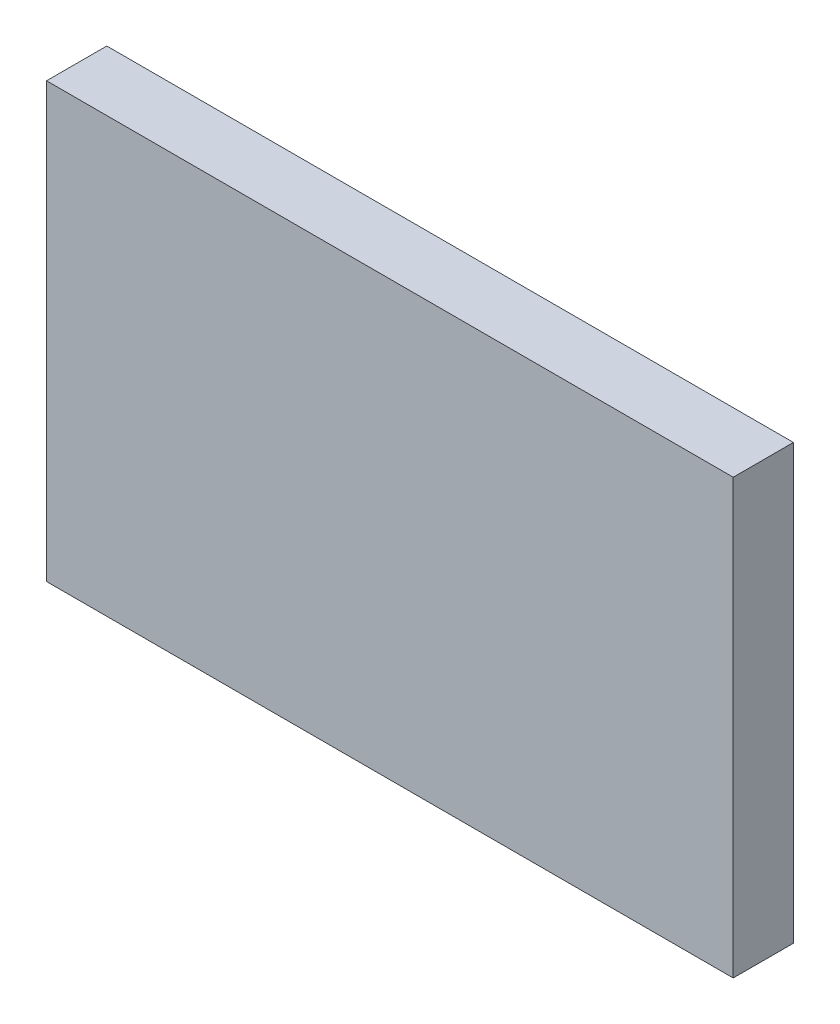
ISO-10303-21;
HEADER;
FILE_DESCRIPTION(('STEP AP214'),'2;1');
FILE_NAME('part.step','',(''),(''),'','','');
FILE_SCHEMA(('AUTOMOTIVE_DESIGN { 1 0 10303 214 1 1 1 1 }'));
ENDSEC;
DATA;
#1=APPLICATION_CONTEXT('core data for automotive mechanical design processes');
#2=APPLICATION_PROTOCOL_DEFINITION('international standard','automotive_design',2000,#1);
#3=PRODUCT_CONTEXT('',#1,'mechanical');
#4=PRODUCT('Part','Part','',(#3));
#5=PRODUCT_RELATED_PRODUCT_CATEGORY('part','',(#4));
#6=PRODUCT_DEFINITION_FORMATION('','',#4);
#7=PRODUCT_DEFINITION_CONTEXT('part definition',#1,'design');
#8=PRODUCT_DEFINITION('design','',#6,#7);
#9=PRODUCT_DEFINITION_SHAPE('','',#8);
#10=(LENGTH_UNIT() NAMED_UNIT(*) SI_UNIT(.MILLI.,.METRE.));
#11=(NAMED_UNIT(*) PLANE_ANGLE_UNIT() SI_UNIT($,.RADIAN.));
#12=(NAMED_UNIT(*) SI_UNIT($,.STERADIAN.) SOLID_ANGLE_UNIT());
#13=UNCERTAINTY_MEASURE_WITH_UNIT(LENGTH_MEASURE(1.E-05),#10,'distance_accuracy_value','');
#14=(GEOMETRIC_REPRESENTATION_CONTEXT(3) GLOBAL_UNCERTAINTY_ASSIGNED_CONTEXT((#13)) GLOBAL_UNIT_ASSIGNED_CONTEXT((#10,
#11,#12)) REPRESENTATION_CONTEXT('',''));
#15=CARTESIAN_POINT('',(0.,0.,0.));
#16=DIRECTION('',(0.,0.,1.));
#17=DIRECTION('',(1.,0.,0.));
#18=AXIS2_PLACEMENT_3D('',#15,#16,#17);
#19=CARTESIAN_POINT('',(0.,0.,5.));
#20=DIRECTION('',(1.,0.,0.));
#21=DIRECTION('',(0.,0.,-1.));
#22=AXIS2_PLACEMENT_3D('',#19,#20,#21);
#23=PLANE('',#22);
#24=DIRECTION('',(0.,-1.,0.));
#25=VECTOR('',#24,1.);
#26=CARTESIAN_POINT('',(0.,0.,0.));
#27=LINE('',#26,#25);
#28=CARTESIAN_POINT('',(0.,36.,0.));
#29=VERTEX_POINT('',#28);
#30=CARTESIAN_POINT('',(0.,0.,0.));
#31=VERTEX_POINT('',#30);
#32=EDGE_CURVE('E100',#29,#31,#27,.T.);
#33=ORIENTED_EDGE('',*,*,#32,.T.);
#34=DIRECTION('',(0.,0.,-1.));
#35=VECTOR('',#34,1.);
#36=CARTESIAN_POINT('',(0.,0.,5.));
#37=LINE('',#36,#35);
#38=CARTESIAN_POINT('',(0.,0.,5.));
#39=VERTEX_POINT('',#38);
#40=EDGE_CURVE('E11',#39,#31,#37,.T.);
#41=ORIENTED_EDGE('',*,*,#40,.F.);
#42=DIRECTION('',(0.,-1.,0.));
#43=VECTOR('',#42,1.);
#44=CARTESIAN_POINT('',(0.,0.,5.));
#45=LINE('',#44,#43);
#46=CARTESIAN_POINT('',(0.,36.,5.));
#47=VERTEX_POINT('',#46);
#48=EDGE_CURVE('E88',#47,#39,#45,.T.);
#49=ORIENTED_EDGE('',*,*,#48,.F.);
#50=DIRECTION('',(0.,0.,-1.));
#51=VECTOR('',#50,1.);
#52=CARTESIAN_POINT('',(0.,36.,5.));
#53=LINE('',#52,#51);
#54=EDGE_CURVE('E96',#47,#29,#53,.T.);
#55=ORIENTED_EDGE('',*,*,#54,.T.);
#56=EDGE_LOOP('',(#33,#41,#49,#55));
#57=FACE_BOUND('',#56,.T.);
#58=ADVANCED_FACE('F37',(#57),#23,.F.);
#59=CARTESIAN_POINT('',(0.,0.,5.));
#60=DIRECTION('',(0.,1.,0.));
#61=DIRECTION('',(0.,0.,1.));
#62=AXIS2_PLACEMENT_3D('',#59,#60,#61);
#63=PLANE('',#62);
#64=DIRECTION('',(1.,0.,0.));
#65=VECTOR('',#64,1.);
#66=CARTESIAN_POINT('',(0.,0.,0.));
#67=LINE('',#66,#65);
#68=CARTESIAN_POINT('',(57.,0.,0.));
#69=VERTEX_POINT('',#68);
#70=EDGE_CURVE('E92',#31,#69,#67,.T.);
#71=ORIENTED_EDGE('',*,*,#70,.T.);
#72=DIRECTION('',(0.,0.,-1.));
#73=VECTOR('',#72,1.);
#74=CARTESIAN_POINT('',(57.,0.,5.));
#75=LINE('',#74,#73);
#76=CARTESIAN_POINT('',(57.,0.,5.));
#77=VERTEX_POINT('',#76);
#78=EDGE_CURVE('E45',#77,#69,#75,.T.);
#79=ORIENTED_EDGE('',*,*,#78,.F.);
#80=DIRECTION('',(1.,0.,0.));
#81=VECTOR('',#80,1.);
#82=CARTESIAN_POINT('',(0.,0.,5.));
#83=LINE('',#82,#81);
#84=EDGE_CURVE('E83',#39,#77,#83,.T.);
#85=ORIENTED_EDGE('',*,*,#84,.F.);
#86=ORIENTED_EDGE('',*,*,#40,.T.);
#87=EDGE_LOOP('',(#71,#79,#85,#86));
#88=FACE_BOUND('',#87,.T.);
#89=ADVANCED_FACE('F91',(#88),#63,.F.);
#90=CARTESIAN_POINT('',(57.,0.,5.));
#91=DIRECTION('',(-1.,0.,0.));
#92=DIRECTION('',(0.,0.,1.));
#93=AXIS2_PLACEMENT_3D('',#90,#91,#92);
#94=PLANE('',#93);
#95=DIRECTION('',(0.,1.,0.));
#96=VECTOR('',#95,1.);
#97=CARTESIAN_POINT('',(57.,0.,0.));
#98=LINE('',#97,#96);
#99=CARTESIAN_POINT('',(57.,36.,0.));
#100=VERTEX_POINT('',#99);
#101=EDGE_CURVE('E70',#69,#100,#98,.T.);
#102=ORIENTED_EDGE('',*,*,#101,.T.);
#103=DIRECTION('',(0.,0.,-1.));
#104=VECTOR('',#103,1.);
#105=CARTESIAN_POINT('',(57.,36.,5.));
#106=LINE('',#105,#104);
#107=CARTESIAN_POINT('',(57.,36.,5.));
#108=VERTEX_POINT('',#107);
#109=EDGE_CURVE('E93',#108,#100,#106,.T.);
#110=ORIENTED_EDGE('',*,*,#109,.F.);
#111=DIRECTION('',(0.,1.,0.));
#112=VECTOR('',#111,1.);
#113=CARTESIAN_POINT('',(57.,0.,5.));
#114=LINE('',#113,#112);
#115=EDGE_CURVE('E86',#77,#108,#114,.T.);
#116=ORIENTED_EDGE('',*,*,#115,.F.);
#117=ORIENTED_EDGE('',*,*,#78,.T.);
#118=EDGE_LOOP('',(#102,#110,#116,#117));
#119=FACE_BOUND('',#118,.T.);
#120=ADVANCED_FACE('F94',(#119),#94,.F.);
#121=CARTESIAN_POINT('',(0.,36.,5.));
#122=DIRECTION('',(0.,-1.,0.));
#123=DIRECTION('',(0.,0.,-1.));
#124=AXIS2_PLACEMENT_3D('',#121,#122,#123);
#125=PLANE('',#124);
#126=DIRECTION('',(-1.,0.,0.));
#127=VECTOR('',#126,1.);
#128=CARTESIAN_POINT('',(0.,36.,0.));
#129=LINE('',#128,#127);
#130=EDGE_CURVE('E76',#100,#29,#129,.T.);
#131=ORIENTED_EDGE('',*,*,#130,.T.);
#132=ORIENTED_EDGE('',*,*,#54,.F.);
#133=DIRECTION('',(-1.,0.,0.));
#134=VECTOR('',#133,1.);
#135=CARTESIAN_POINT('',(0.,36.,5.));
#136=LINE('',#135,#134);
#137=EDGE_CURVE('E53',#108,#47,#136,.T.);
#138=ORIENTED_EDGE('',*,*,#137,.F.);
#139=ORIENTED_EDGE('',*,*,#109,.T.);
#140=EDGE_LOOP('',(#131,#132,#138,#139));
#141=FACE_BOUND('',#140,.T.);
#142=ADVANCED_FACE('F107',(#141),#125,.F.);
#143=CARTESIAN_POINT('',(0.,0.,5.));
#144=DIRECTION('',(0.,0.,-1.));
#145=DIRECTION('',(-1.,0.,0.));
#146=AXIS2_PLACEMENT_3D('',#143,#144,#145);
#147=PLANE('',#146);
#148=ORIENTED_EDGE('',*,*,#48,.T.);
#149=ORIENTED_EDGE('',*,*,#84,.T.);
#150=ORIENTED_EDGE('',*,*,#115,.T.);
#151=ORIENTED_EDGE('',*,*,#137,.T.);
#152=EDGE_LOOP('',(#148,#149,#150,#151));
#153=FACE_BOUND('',#152,.T.);
#154=ADVANCED_FACE('F84',(#153),#147,.F.);
#155=CARTESIAN_POINT('',(0.,0.,0.));
#156=DIRECTION('',(0.,0.,-1.));
#157=DIRECTION('',(-1.,0.,0.));
#158=AXIS2_PLACEMENT_3D('',#155,#156,#157);
#159=PLANE('',#158);
#160=ORIENTED_EDGE('',*,*,#32,.F.);
#161=ORIENTED_EDGE('',*,*,#130,.F.);
#162=ORIENTED_EDGE('',*,*,#101,.F.);
#163=ORIENTED_EDGE('',*,*,#70,.F.);
#164=EDGE_LOOP('',(#160,#161,#162,#163));
#165=FACE_BOUND('',#164,.T.);
#166=ADVANCED_FACE('F110',(#165),#159,.T.);
#167=CLOSED_SHELL('',(#58,#89,#120,#142,#154,#166));
#168=MANIFOLD_SOLID_BREP('B2',#167);
#169=ADVANCED_BREP_SHAPE_REPRESENTATION('',(#18,#168),#14);
#170=SHAPE_DEFINITION_REPRESENTATION(#9,#169);
ENDSEC;
END-ISO-10303-21;
